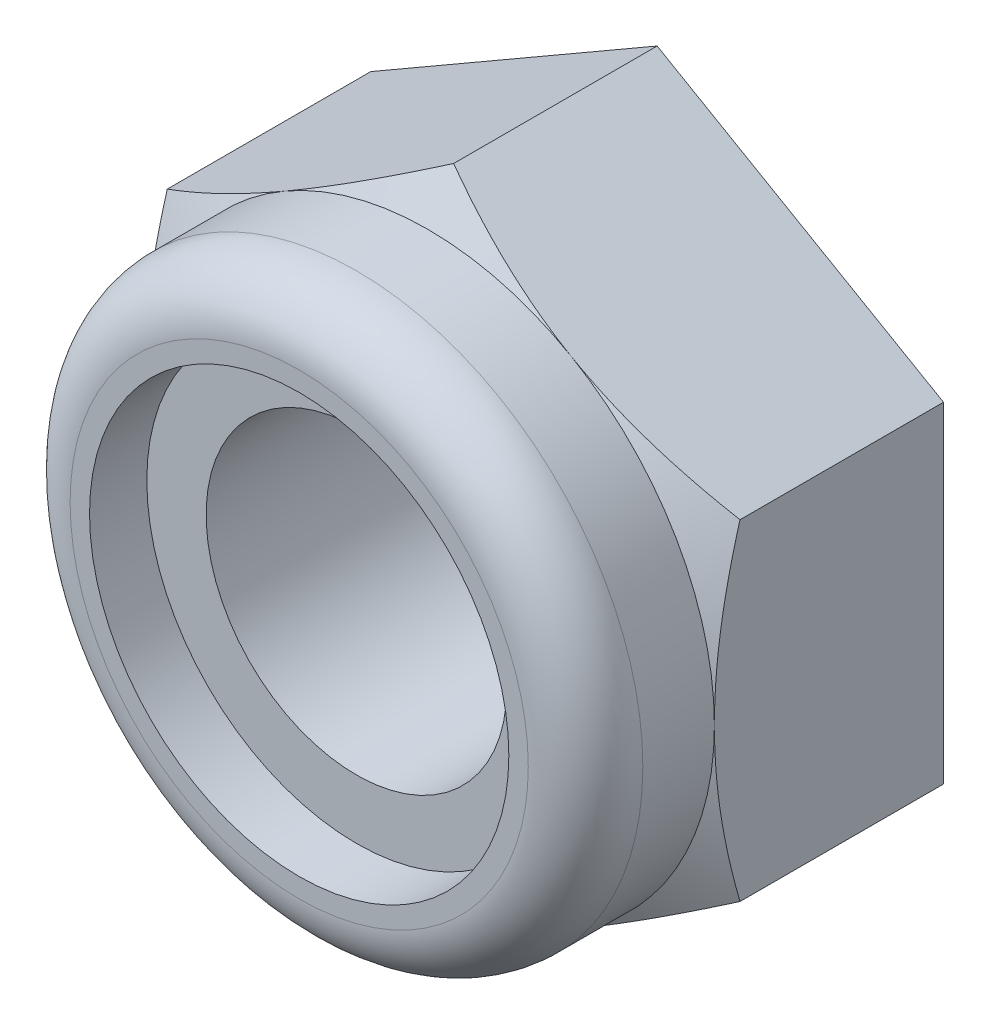
ISO-10303-21;
HEADER;
FILE_DESCRIPTION(('STEP AP214'),'2;1');
FILE_NAME('part.step','',(''),(''),'','','');
FILE_SCHEMA(('AUTOMOTIVE_DESIGN { 1 0 10303 214 1 1 1 1 }'));
ENDSEC;
DATA;
#1=APPLICATION_CONTEXT('core data for automotive mechanical design processes');
#2=APPLICATION_PROTOCOL_DEFINITION('international standard','automotive_design',2000,#1);
#3=PRODUCT_CONTEXT('',#1,'mechanical');
#4=PRODUCT('Part','Part','',(#3));
#5=PRODUCT_RELATED_PRODUCT_CATEGORY('part','',(#4));
#6=PRODUCT_DEFINITION_FORMATION('','',#4);
#7=PRODUCT_DEFINITION_CONTEXT('part definition',#1,'design');
#8=PRODUCT_DEFINITION('design','',#6,#7);
#9=PRODUCT_DEFINITION_SHAPE('','',#8);
#10=(LENGTH_UNIT() NAMED_UNIT(*) SI_UNIT(.MILLI.,.METRE.));
#11=(NAMED_UNIT(*) PLANE_ANGLE_UNIT() SI_UNIT($,.RADIAN.));
#12=(NAMED_UNIT(*) SI_UNIT($,.STERADIAN.) SOLID_ANGLE_UNIT());
#13=UNCERTAINTY_MEASURE_WITH_UNIT(LENGTH_MEASURE(1.E-05),#10,'distance_accuracy_value','');
#14=(GEOMETRIC_REPRESENTATION_CONTEXT(3) GLOBAL_UNCERTAINTY_ASSIGNED_CONTEXT((#13)) GLOBAL_UNIT_ASSIGNED_CONTEXT((#10,
#11,#12)) REPRESENTATION_CONTEXT('',''));
#15=CARTESIAN_POINT('',(0.,0.,0.));
#16=DIRECTION('',(0.,0.,1.));
#17=DIRECTION('',(1.,0.,0.));
#18=AXIS2_PLACEMENT_3D('',#15,#16,#17);
#19=CARTESIAN_POINT('',(0.,0.,-4.4));
#20=DIRECTION('',(0.,0.,1.));
#21=DIRECTION('',(1.,0.,0.));
#22=AXIS2_PLACEMENT_3D('',#19,#20,#21);
#23=CYLINDRICAL_SURFACE('',#22,2.1);
#24=CARTESIAN_POINT('',(0.,0.,1.6));
#25=DIRECTION('',(0.,0.,1.));
#26=DIRECTION('',(1.,0.,0.));
#27=AXIS2_PLACEMENT_3D('',#24,#25,#26);
#28=CIRCLE('',#27,2.1);
#29=CARTESIAN_POINT('',(2.1,0.,1.6));
#30=VERTEX_POINT('',#29);
#31=EDGE_CURVE('E367',#30,#30,#28,.T.);
#32=ORIENTED_EDGE('',*,*,#31,.T.);
#33=EDGE_LOOP('',(#32));
#34=FACE_BOUND('',#33,.T.);
#35=CARTESIAN_POINT('',(0.,0.,-1.8971227249455));
#36=DIRECTION('',(0.,0.,-1.));
#37=DIRECTION('',(-1.,0.,0.));
#38=AXIS2_PLACEMENT_3D('',#35,#36,#37);
#39=CIRCLE('',#38,2.1);
#40=CARTESIAN_POINT('',(-2.1,0.,-1.8971227249455));
#41=VERTEX_POINT('',#40);
#42=EDGE_CURVE('E127',#41,#41,#39,.F.);
#43=ORIENTED_EDGE('',*,*,#42,.F.);
#44=EDGE_LOOP('',(#43));
#45=FACE_BOUND('',#44,.T.);
#46=ADVANCED_FACE('F54',(#34,#45),#23,.F.);
#47=CARTESIAN_POINT('',(0.,4.61880215351701,-4.4));
#48=DIRECTION('',(-0.5,0.866025403784438,0.));
#49=DIRECTION('',(-0.866025403784438,-0.5,0.));
#50=AXIS2_PLACEMENT_3D('',#47,#48,#49);
#51=PLANE('',#50);
#52=DIRECTION('',(-0.866025403784438,-0.5,0.));
#53=VECTOR('',#52,1.);
#54=CARTESIAN_POINT('',(0.,4.61880215351701,-2.6));
#55=LINE('',#54,#53);
#56=CARTESIAN_POINT('',(0.,4.61880215351701,-2.6));
#57=VERTEX_POINT('',#56);
#58=CARTESIAN_POINT('',(-4.,2.3094010767585,-2.6));
#59=VERTEX_POINT('',#58);
#60=EDGE_CURVE('E413',#57,#59,#55,.T.);
#61=ORIENTED_EDGE('',*,*,#60,.T.);
#62=DIRECTION('',(0.,0.,1.));
#63=VECTOR('',#62,1.);
#64=CARTESIAN_POINT('',(-4.,2.3094010767585,-4.4));
#65=LINE('',#64,#63);
#66=CARTESIAN_POINT('',(-4.,2.3094010767585,0.242734410091837));
#67=VERTEX_POINT('',#66);
#68=EDGE_CURVE('E150',#59,#67,#65,.T.);
#69=ORIENTED_EDGE('',*,*,#68,.T.);
#70=CARTESIAN_POINT('',(-4.00000000000001,2.3094010767585,0.242734410091836));
#71=CARTESIAN_POINT('',(-3.82575509941556,2.41000141701585,0.300843254021568));
#72=CARTESIAN_POINT('',(-3.64998668642037,2.51148135757366,0.353730679374339));
#73=CARTESIAN_POINT('',(-3.29691182621124,2.71532922315949,0.445810427784581));
#74=CARTESIAN_POINT('',(-3.11962086224101,2.81768820893259,0.485082757176557));
#75=CARTESIAN_POINT('',(-2.85195331749383,2.9722261379457,0.531878924916784));
#76=CARTESIAN_POINT('',(-2.7623723562373,3.02394573004142,0.545464733371018));
#77=CARTESIAN_POINT('',(-2.58279348128188,3.1276256418377,0.568282401920135));
#78=CARTESIAN_POINT('',(-2.49279557589336,3.17958595674027,0.577514348420689));
#79=CARTESIAN_POINT('',(-2.31199667955197,3.28397024821216,0.591428046662609));
#80=CARTESIAN_POINT('',(-2.22119409510796,3.33639514478402,0.596082420263347));
#81=CARTESIAN_POINT('',(-2.03948107892015,3.44130720359531,0.600649416944741));
#82=CARTESIAN_POINT('',(-1.94857062855305,3.49379437658691,0.6005610454281));
#83=CARTESIAN_POINT('',(-1.8577066320852,3.54625472940727,0.598052513925055));
#84=B_SPLINE_CURVE_WITH_KNOTS('',3,(#70,#71,#72,#73,#74,#75,#76,#77,#78,#79,#80,#81,#82,#83),
.UNSPECIFIED.,.F.,.F.,(4,2,2,2,2,2,4),(0.,0.628587110626975,1.25341522710677,1.56631348907087,
1.87920554107184,2.19395779996624,2.50877606556367),.UNSPECIFIED.);
#85=CARTESIAN_POINT('',(-2.,3.46410161513776,0.599999999999999));
#86=VERTEX_POINT('',#85);
#87=EDGE_CURVE('E291',#67,#86,#84,.T.);
#88=ORIENTED_EDGE('',*,*,#87,.T.);
#89=CARTESIAN_POINT('',(0.,4.61880215351701,0.242734410091839));
#90=CARTESIAN_POINT('',(-0.174244900584449,4.51820181325966,0.30084325402157));
#91=CARTESIAN_POINT('',(-0.350013313579644,4.41672187270185,0.353730679374341));
#92=CARTESIAN_POINT('',(-0.703088173788774,4.21287400711602,0.445810427784582));
#93=CARTESIAN_POINT('',(-0.880379137758998,4.11051502134292,0.485082757176558));
#94=CARTESIAN_POINT('',(-1.14804668250618,3.95597709232981,0.531878924916784));
#95=CARTESIAN_POINT('',(-1.2376276437627,3.90425750023409,0.545464733371018));
#96=CARTESIAN_POINT('',(-1.41720651871812,3.80057758843781,0.568282401920135));
#97=CARTESIAN_POINT('',(-1.50720442410665,3.74861727353524,0.577514348420689));
#98=CARTESIAN_POINT('',(-1.68800332044804,3.64423298206335,0.591428046662609));
#99=CARTESIAN_POINT('',(-1.77880590489205,3.59180808549149,0.596082420263347));
#100=CARTESIAN_POINT('',(-1.96051892107985,3.4868960266802,0.60064941694474));
#101=CARTESIAN_POINT('',(-2.05142937144696,3.4344088536886,0.6005610454281));
#102=CARTESIAN_POINT('',(-2.1422933679148,3.38194850086825,0.598052513925055));
#103=B_SPLINE_CURVE_WITH_KNOTS('',3,(#89,#90,#91,#92,#93,#94,#95,#96,#97,#98,#99,#100,#101,
#102),.UNSPECIFIED.,.F.,.F.,(4,2,2,2,2,2,4),(0.,0.628587110626971,1.25341522710677,
1.56631348907086,1.87920554107183,2.19395779996622,2.50877606556365),.UNSPECIFIED.);
#104=CARTESIAN_POINT('',(0.,4.61880215351701,0.242734410091834));
#105=VERTEX_POINT('',#104);
#106=EDGE_CURVE('E141',#86,#105,#103,.F.);
#107=ORIENTED_EDGE('',*,*,#106,.T.);
#108=DIRECTION('',(0.,0.,1.));
#109=VECTOR('',#108,1.);
#110=CARTESIAN_POINT('',(0.,4.61880215351701,-4.4));
#111=LINE('',#110,#109);
#112=EDGE_CURVE('E148',#57,#105,#111,.T.);
#113=ORIENTED_EDGE('',*,*,#112,.F.);
#114=EDGE_LOOP('',(#61,#69,#88,#107,#113));
#115=FACE_BOUND('',#114,.T.);
#116=ADVANCED_FACE('F173',(#115),#51,.T.);
#117=CARTESIAN_POINT('',(4.,2.3094010767585,-4.4));
#118=DIRECTION('',(0.5,0.866025403784438,0.));
#119=DIRECTION('',(-0.866025403784438,0.5,0.));
#120=AXIS2_PLACEMENT_3D('',#117,#118,#119);
#121=PLANE('',#120);
#122=ORIENTED_EDGE('',*,*,#112,.T.);
#123=CARTESIAN_POINT('',(0.,4.61880215351701,0.242734410091837));
#124=CARTESIAN_POINT('',(0.174244900584437,4.51820181325966,0.300843254021569));
#125=CARTESIAN_POINT('',(0.350013313579632,4.41672187270185,0.35373067937434));
#126=CARTESIAN_POINT('',(0.703088173788763,4.21287400711602,0.445810427784583));
#127=CARTESIAN_POINT('',(0.880379137758989,4.11051502134292,0.485082757176559));
#128=CARTESIAN_POINT('',(1.14804668250617,3.95597709232981,0.531878924916785));
#129=CARTESIAN_POINT('',(1.2376276437627,3.90425750023409,0.545464733371019));
#130=CARTESIAN_POINT('',(1.41720651871811,3.80057758843781,0.568282401920137));
#131=CARTESIAN_POINT('',(1.50720442410664,3.74861727353524,0.577514348420691));
#132=CARTESIAN_POINT('',(1.68800332044803,3.64423298206335,0.591428046662611));
#133=CARTESIAN_POINT('',(1.77880590489204,3.59180808549149,0.59608242026335));
#134=CARTESIAN_POINT('',(1.96051892107985,3.4868960266802,0.600649416944743));
#135=CARTESIAN_POINT('',(2.05142937144695,3.4344088536886,0.600561045428103));
#136=CARTESIAN_POINT('',(2.1422933679148,3.38194850086825,0.598052513925058));
#137=B_SPLINE_CURVE_WITH_KNOTS('',3,(#123,#124,#125,#126,#127,#128,#129,#130,#131,#132,#133,
#134,#135,#136),.UNSPECIFIED.,.F.,.F.,(4,2,2,2,2,2,4),(0.,0.628587110626975,1.25341522710677,
1.56631348907087,1.87920554107184,2.19395779996623,2.50877606556367),.UNSPECIFIED.);
#138=CARTESIAN_POINT('',(2.,3.46410161513775,0.600000000000001));
#139=VERTEX_POINT('',#138);
#140=EDGE_CURVE('E136',#105,#139,#137,.T.);
#141=ORIENTED_EDGE('',*,*,#140,.T.);
#142=CARTESIAN_POINT('',(4.,2.3094010767585,0.242734410091839));
#143=CARTESIAN_POINT('',(3.82575509941556,2.41000141701585,0.30084325402157));
#144=CARTESIAN_POINT('',(3.64998668642036,2.51148135757366,0.353730679374342));
#145=CARTESIAN_POINT('',(3.29691182621123,2.71532922315949,0.445810427784584));
#146=CARTESIAN_POINT('',(3.11962086224101,2.81768820893259,0.485082757176559));
#147=CARTESIAN_POINT('',(2.85195331749383,2.9722261379457,0.531878924916786));
#148=CARTESIAN_POINT('',(2.7623723562373,3.02394573004142,0.54546473337102));
#149=CARTESIAN_POINT('',(2.58279348128188,3.1276256418377,0.568282401920137));
#150=CARTESIAN_POINT('',(2.49279557589336,3.17958595674027,0.577514348420692));
#151=CARTESIAN_POINT('',(2.31199667955197,3.28397024821215,0.591428046662611));
#152=CARTESIAN_POINT('',(2.22119409510795,3.33639514478402,0.59608242026335));
#153=CARTESIAN_POINT('',(2.03948107892015,3.44130720359531,0.600649416944743));
#154=CARTESIAN_POINT('',(1.94857062855305,3.49379437658691,0.600561045428102));
#155=CARTESIAN_POINT('',(1.8577066320852,3.54625472940726,0.598052513925058));
#156=B_SPLINE_CURVE_WITH_KNOTS('',3,(#142,#143,#144,#145,#146,#147,#148,#149,#150,#151,#152,
#153,#154,#155),.UNSPECIFIED.,.F.,.F.,(4,2,2,2,2,2,4),(0.,0.628587110626974,1.25341522710677,
1.56631348907087,1.87920554107184,2.19395779996623,2.50877606556366),.UNSPECIFIED.);
#157=CARTESIAN_POINT('',(4.,2.3094010767585,0.242734410091837));
#158=VERTEX_POINT('',#157);
#159=EDGE_CURVE('E129',#139,#158,#156,.F.);
#160=ORIENTED_EDGE('',*,*,#159,.T.);
#161=DIRECTION('',(0.,0.,1.));
#162=VECTOR('',#161,1.);
#163=CARTESIAN_POINT('',(4.,2.3094010767585,-4.4));
#164=LINE('',#163,#162);
#165=CARTESIAN_POINT('',(4.,2.3094010767585,-2.6));
#166=VERTEX_POINT('',#165);
#167=EDGE_CURVE('E310',#166,#158,#164,.T.);
#168=ORIENTED_EDGE('',*,*,#167,.F.);
#169=DIRECTION('',(-0.866025403784438,0.5,0.));
#170=VECTOR('',#169,1.);
#171=CARTESIAN_POINT('',(4.,2.3094010767585,-2.6));
#172=LINE('',#171,#170);
#173=EDGE_CURVE('E415',#166,#57,#172,.T.);
#174=ORIENTED_EDGE('',*,*,#173,.T.);
#175=EDGE_LOOP('',(#122,#141,#160,#168,#174));
#176=FACE_BOUND('',#175,.T.);
#177=ADVANCED_FACE('F145',(#176),#121,.T.);
#178=CARTESIAN_POINT('',(4.,2.3094010767585,-4.4));
#179=DIRECTION('',(-1.,0.,0.));
#180=DIRECTION('',(0.,0.,1.));
#181=AXIS2_PLACEMENT_3D('',#178,#179,#180);
#182=PLANE('',#181);
#183=DIRECTION('',(0.,0.,1.));
#184=VECTOR('',#183,1.);
#185=CARTESIAN_POINT('',(4.,-2.30940107675851,-4.4));
#186=LINE('',#185,#184);
#187=CARTESIAN_POINT('',(4.,-2.30940107675851,-2.6));
#188=VERTEX_POINT('',#187);
#189=CARTESIAN_POINT('',(4.,-2.30940107675851,0.242734410091836));
#190=VERTEX_POINT('',#189);
#191=EDGE_CURVE('E305',#188,#190,#186,.T.);
#192=ORIENTED_EDGE('',*,*,#191,.F.);
#193=DIRECTION('',(0.,1.,0.));
#194=VECTOR('',#193,1.);
#195=CARTESIAN_POINT('',(4.,4.61880215351701,-2.6));
#196=LINE('',#195,#194);
#197=EDGE_CURVE('E14',#188,#166,#196,.T.);
#198=ORIENTED_EDGE('',*,*,#197,.T.);
#199=ORIENTED_EDGE('',*,*,#167,.T.);
#200=CARTESIAN_POINT('',(4.,2.3094010767585,0.24273441009184));
#201=CARTESIAN_POINT('',(4.,2.1082003962438,0.300843254021571));
#202=CARTESIAN_POINT('',(4.,1.90524051512819,0.353730679374342));
#203=CARTESIAN_POINT('',(4.,1.49754478395652,0.445810427784584));
#204=CARTESIAN_POINT('',(4.,1.29282681241033,0.485082757176559));
#205=CARTESIAN_POINT('',(4.,0.983750954384108,0.531878924916786));
#206=CARTESIAN_POINT('',(4.,0.880311770192666,0.54546473337102));
#207=CARTESIAN_POINT('',(4.,0.672951946600103,0.568282401920137));
#208=CARTESIAN_POINT('',(4.,0.56903131679497,0.577514348420691));
#209=CARTESIAN_POINT('',(4.,0.360262733851193,0.59142804666261));
#210=CARTESIAN_POINT('',(4.,0.255412940707462,0.596082420263349));
#211=CARTESIAN_POINT('',(4.,0.045588823084889,0.600649416944742));
#212=CARTESIAN_POINT('',(4.,-0.059385522898308,0.600561045428102));
#213=CARTESIAN_POINT('',(4.,-0.164306228539019,0.598052513925057));
#214=B_SPLINE_CURVE_WITH_KNOTS('',3,(#200,#201,#202,#203,#204,#205,#206,#207,#208,#209,#210,
#211,#212,#213),.UNSPECIFIED.,.F.,.F.,(4,2,2,2,2,2,4),(0.,0.628587110626973,1.25341522710677,
1.56631348907087,1.87920554107183,2.19395779996623,2.50877606556366),.UNSPECIFIED.);
#215=CARTESIAN_POINT('',(4.,0.,0.6));
#216=VERTEX_POINT('',#215);
#217=EDGE_CURVE('E131',#216,#158,#214,.F.);
#218=ORIENTED_EDGE('',*,*,#217,.F.);
#219=CARTESIAN_POINT('',(4.,-2.3094010767585,0.24273441009184));
#220=CARTESIAN_POINT('',(4.,-2.1082003962438,0.300843254021572));
#221=CARTESIAN_POINT('',(4.,-1.90524051512819,0.353730679374343));
#222=CARTESIAN_POINT('',(4.,-1.49754478395652,0.445810427784584));
#223=CARTESIAN_POINT('',(4.,-1.29282681241033,0.485082757176559));
#224=CARTESIAN_POINT('',(4.,-0.98375095438411,0.531878924916785));
#225=CARTESIAN_POINT('',(4.,-0.880311770192668,0.54546473337102));
#226=CARTESIAN_POINT('',(4.,-0.672951946600106,0.568282401920137));
#227=CARTESIAN_POINT('',(4.,-0.569031316794973,0.577514348420691));
#228=CARTESIAN_POINT('',(4.,-0.360262733851196,0.59142804666261));
#229=CARTESIAN_POINT('',(4.,-0.255412940707466,0.596082420263349));
#230=CARTESIAN_POINT('',(4.,-0.0455888230848929,0.600649416944742));
#231=CARTESIAN_POINT('',(4.,0.0593855228983036,0.600561045428102));
#232=CARTESIAN_POINT('',(4.,0.164306228539015,0.598052513925057));
#233=B_SPLINE_CURVE_WITH_KNOTS('',3,(#219,#220,#221,#222,#223,#224,#225,#226,#227,#228,#229,
#230,#231,#232),.UNSPECIFIED.,.F.,.F.,(4,2,2,2,2,2,4),(0.,0.628587110626971,1.25341522710677,
1.56631348907086,1.87920554107183,2.19395779996622,2.50877606556365),.UNSPECIFIED.);
#234=EDGE_CURVE('E233',#190,#216,#233,.T.);
#235=ORIENTED_EDGE('',*,*,#234,.F.);
#236=EDGE_LOOP('',(#192,#198,#199,#218,#235));
#237=FACE_BOUND('',#236,.T.);
#238=ADVANCED_FACE('F172',(#237),#182,.F.);
#239=CARTESIAN_POINT('',(0.,-4.61880215351702,-4.4));
#240=DIRECTION('',(0.5,-0.866025403784438,0.));
#241=DIRECTION('',(0.866025403784438,0.5,0.));
#242=AXIS2_PLACEMENT_3D('',#239,#240,#241);
#243=PLANE('',#242);
#244=ORIENTED_EDGE('',*,*,#191,.T.);
#245=CARTESIAN_POINT('',(4.,-2.30940107675851,0.242734410091835));
#246=CARTESIAN_POINT('',(3.82575509941556,-2.41000141701586,0.300843254021566));
#247=CARTESIAN_POINT('',(3.64998668642036,-2.51148135757367,0.353730679374337));
#248=CARTESIAN_POINT('',(3.29691182621123,-2.7153292231595,0.445810427784579));
#249=CARTESIAN_POINT('',(3.11962086224101,-2.8176882089326,0.485082757176554));
#250=CARTESIAN_POINT('',(2.85195331749383,-2.97222613794571,0.53187892491678));
#251=CARTESIAN_POINT('',(2.7623723562373,-3.02394573004143,0.545464733371014));
#252=CARTESIAN_POINT('',(2.58279348128188,-3.12762564183772,0.56828240192013));
#253=CARTESIAN_POINT('',(2.49279557589336,-3.17958595674028,0.577514348420685));
#254=CARTESIAN_POINT('',(2.31199667955197,-3.28397024821217,0.591428046662604));
#255=CARTESIAN_POINT('',(2.22119409510795,-3.33639514478404,0.596082420263342));
#256=CARTESIAN_POINT('',(2.03948107892015,-3.44130720359532,0.600649416944735));
#257=CARTESIAN_POINT('',(1.94857062855304,-3.49379437658692,0.600561045428094));
#258=CARTESIAN_POINT('',(1.8577066320852,-3.54625472940728,0.59805251392505));
#259=B_SPLINE_CURVE_WITH_KNOTS('',3,(#245,#246,#247,#248,#249,#250,#251,#252,#253,#254,#255,
#256,#257,#258),.UNSPECIFIED.,.F.,.F.,(4,2,2,2,2,2,4),(0.,0.628587110626974,1.25341522710677,
1.56631348907087,1.87920554107184,2.19395779996623,2.50877606556366),.UNSPECIFIED.);
#260=CARTESIAN_POINT('',(2.,-3.46410161513776,0.599999999999997));
#261=VERTEX_POINT('',#260);
#262=EDGE_CURVE('E226',#190,#261,#259,.T.);
#263=ORIENTED_EDGE('',*,*,#262,.T.);
#264=CARTESIAN_POINT('',(0.,-4.61880215351702,0.242734410091832));
#265=CARTESIAN_POINT('',(0.174244900584447,-4.51820181325967,0.300843254021563));
#266=CARTESIAN_POINT('',(0.350013313579643,-4.41672187270186,0.353730679374334));
#267=CARTESIAN_POINT('',(0.703088173788774,-4.21287400711603,0.445810427784576));
#268=CARTESIAN_POINT('',(0.880379137758999,-4.11051502134293,0.485082757176552));
#269=CARTESIAN_POINT('',(1.14804668250618,-3.95597709232982,0.531878924916779));
#270=CARTESIAN_POINT('',(1.23762764376271,-3.9042575002341,0.545464733371012));
#271=CARTESIAN_POINT('',(1.41720651871812,-3.80057758843782,0.56828240192013));
#272=CARTESIAN_POINT('',(1.50720442410665,-3.74861727353525,0.577514348420684));
#273=CARTESIAN_POINT('',(1.68800332044804,-3.64423298206336,0.591428046662604));
#274=CARTESIAN_POINT('',(1.77880590489205,-3.5918080854915,0.596082420263342));
#275=CARTESIAN_POINT('',(1.96051892107986,-3.48689602668021,0.600649416944735));
#276=CARTESIAN_POINT('',(2.05142937144696,-3.43440885368861,0.600561045428094));
#277=CARTESIAN_POINT('',(2.14229336791481,-3.38194850086826,0.59805251392505));
#278=B_SPLINE_CURVE_WITH_KNOTS('',3,(#264,#265,#266,#267,#268,#269,#270,#271,#272,#273,#274,
#275,#276,#277),.UNSPECIFIED.,.F.,.F.,(4,2,2,2,2,2,4),(0.,0.628587110626974,1.25341522710677,
1.56631348907087,1.87920554107184,2.19395779996623,2.50877606556366),.UNSPECIFIED.);
#279=CARTESIAN_POINT('',(0.,-4.61880215351702,0.242734410091828));
#280=VERTEX_POINT('',#279);
#281=EDGE_CURVE('E234',#261,#280,#278,.F.);
#282=ORIENTED_EDGE('',*,*,#281,.T.);
#283=DIRECTION('',(0.,0.,1.));
#284=VECTOR('',#283,1.);
#285=CARTESIAN_POINT('',(0.,-4.61880215351702,-4.4));
#286=LINE('',#285,#284);
#287=CARTESIAN_POINT('',(0.,-4.61880215351702,-2.6));
#288=VERTEX_POINT('',#287);
#289=EDGE_CURVE('E311',#288,#280,#286,.T.);
#290=ORIENTED_EDGE('',*,*,#289,.F.);
#291=DIRECTION('',(0.866025403784438,0.5,0.));
#292=VECTOR('',#291,1.);
#293=CARTESIAN_POINT('',(0.,-4.61880215351702,-2.6));
#294=LINE('',#293,#292);
#295=EDGE_CURVE('E309',#288,#188,#294,.T.);
#296=ORIENTED_EDGE('',*,*,#295,.T.);
#297=EDGE_LOOP('',(#244,#263,#282,#290,#296));
#298=FACE_BOUND('',#297,.T.);
#299=ADVANCED_FACE('F215',(#298),#243,.T.);
#300=CARTESIAN_POINT('',(-4.,-2.30940107675851,-4.4));
#301=DIRECTION('',(-0.5,-0.866025403784438,0.));
#302=DIRECTION('',(0.866025403784438,-0.5,0.));
#303=AXIS2_PLACEMENT_3D('',#300,#301,#302);
#304=PLANE('',#303);
#305=ORIENTED_EDGE('',*,*,#289,.T.);
#306=CARTESIAN_POINT('',(0.,-4.61880215351702,0.242734410091833));
#307=CARTESIAN_POINT('',(-0.17424490058444,-4.51820181325967,0.300843254021564));
#308=CARTESIAN_POINT('',(-0.350013313579635,-4.41672187270186,0.353730679374335));
#309=CARTESIAN_POINT('',(-0.703088173788766,-4.21287400711603,0.445810427784578));
#310=CARTESIAN_POINT('',(-0.880379137758992,-4.11051502134293,0.485082757176553));
#311=CARTESIAN_POINT('',(-1.14804668250617,-3.95597709232982,0.531878924916781));
#312=CARTESIAN_POINT('',(-1.2376276437627,-3.9042575002341,0.545464733371015));
#313=CARTESIAN_POINT('',(-1.41720651871812,-3.80057758843782,0.568282401920132));
#314=CARTESIAN_POINT('',(-1.50720442410664,-3.74861727353525,0.577514348420686));
#315=CARTESIAN_POINT('',(-1.68800332044803,-3.64423298206336,0.591428046662606));
#316=CARTESIAN_POINT('',(-1.77880590489205,-3.5918080854915,0.596082420263344));
#317=CARTESIAN_POINT('',(-1.96051892107985,-3.48689602668021,0.600649416944738));
#318=CARTESIAN_POINT('',(-2.05142937144696,-3.43440885368861,0.600561045428097));
#319=CARTESIAN_POINT('',(-2.1422933679148,-3.38194850086825,0.598052513925053));
#320=B_SPLINE_CURVE_WITH_KNOTS('',3,(#306,#307,#308,#309,#310,#311,#312,#313,#314,#315,#316,
#317,#318,#319),.UNSPECIFIED.,.F.,.F.,(4,2,2,2,2,2,4),(0.,0.628587110626975,1.25341522710677,
1.56631348907087,1.87920554107184,2.19395779996624,2.50877606556367),.UNSPECIFIED.);
#321=CARTESIAN_POINT('',(-2.,-3.46410161513776,0.599999999999998));
#322=VERTEX_POINT('',#321);
#323=EDGE_CURVE('E245',#280,#322,#320,.T.);
#324=ORIENTED_EDGE('',*,*,#323,.T.);
#325=CARTESIAN_POINT('',(-4.,-2.30940107675851,0.242734410091837));
#326=CARTESIAN_POINT('',(-3.82575509941556,-2.41000141701586,0.300843254021568));
#327=CARTESIAN_POINT('',(-3.64998668642036,-2.51148135757367,0.353730679374339));
#328=CARTESIAN_POINT('',(-3.29691182621123,-2.7153292231595,0.445810427784581));
#329=CARTESIAN_POINT('',(-3.11962086224101,-2.8176882089326,0.485082757176556));
#330=CARTESIAN_POINT('',(-2.85195331749383,-2.97222613794571,0.531878924916782));
#331=CARTESIAN_POINT('',(-2.7623723562373,-3.02394573004143,0.545464733371016));
#332=CARTESIAN_POINT('',(-2.58279348128188,-3.12762564183771,0.568282401920133));
#333=CARTESIAN_POINT('',(-2.49279557589336,-3.17958595674028,0.577514348420687));
#334=CARTESIAN_POINT('',(-2.31199667955197,-3.28397024821217,0.591428046662606));
#335=CARTESIAN_POINT('',(-2.22119409510795,-3.33639514478403,0.596082420263345));
#336=CARTESIAN_POINT('',(-2.03948107892015,-3.44130720359532,0.600649416944738));
#337=CARTESIAN_POINT('',(-1.94857062855304,-3.49379437658692,0.600561045428097));
#338=CARTESIAN_POINT('',(-1.8577066320852,-3.54625472940727,0.598052513925052));
#339=B_SPLINE_CURVE_WITH_KNOTS('',3,(#325,#326,#327,#328,#329,#330,#331,#332,#333,#334,#335,
#336,#337,#338),.UNSPECIFIED.,.F.,.F.,(4,2,2,2,2,2,4),(0.,0.628587110626974,1.25341522710677,
1.56631348907087,1.87920554107184,2.19395779996623,2.50877606556366),.UNSPECIFIED.);
#340=CARTESIAN_POINT('',(-4.,-2.30940107675851,0.242734410091834));
#341=VERTEX_POINT('',#340);
#342=EDGE_CURVE('E252',#322,#341,#339,.F.);
#343=ORIENTED_EDGE('',*,*,#342,.T.);
#344=DIRECTION('',(0.,0.,1.));
#345=VECTOR('',#344,1.);
#346=CARTESIAN_POINT('',(-4.,-2.30940107675851,-4.4));
#347=LINE('',#346,#345);
#348=CARTESIAN_POINT('',(-4.,-2.30940107675851,-2.6));
#349=VERTEX_POINT('',#348);
#350=EDGE_CURVE('E315',#349,#341,#347,.T.);
#351=ORIENTED_EDGE('',*,*,#350,.F.);
#352=DIRECTION('',(0.866025403784438,-0.5,0.));
#353=VECTOR('',#352,1.);
#354=CARTESIAN_POINT('',(-4.,-2.30940107675851,-2.6));
#355=LINE('',#354,#353);
#356=EDGE_CURVE('E334',#349,#288,#355,.T.);
#357=ORIENTED_EDGE('',*,*,#356,.T.);
#358=EDGE_LOOP('',(#305,#324,#343,#351,#357));
#359=FACE_BOUND('',#358,.T.);
#360=ADVANCED_FACE('F218',(#359),#304,.T.);
#361=CARTESIAN_POINT('',(-4.,2.3094010767585,-4.4));
#362=DIRECTION('',(-1.,0.,0.));
#363=DIRECTION('',(0.,0.,1.));
#364=AXIS2_PLACEMENT_3D('',#361,#362,#363);
#365=PLANE('',#364);
#366=ORIENTED_EDGE('',*,*,#68,.F.);
#367=DIRECTION('',(0.,-1.,0.));
#368=VECTOR('',#367,1.);
#369=CARTESIAN_POINT('',(-4.,2.3094010767585,-2.6));
#370=LINE('',#369,#368);
#371=EDGE_CURVE('E65',#59,#349,#370,.T.);
#372=ORIENTED_EDGE('',*,*,#371,.T.);
#373=ORIENTED_EDGE('',*,*,#350,.T.);
#374=CARTESIAN_POINT('',(-4.,-2.3094010767585,0.242734410091839));
#375=CARTESIAN_POINT('',(-4.,-2.10820039624381,0.30084325402157));
#376=CARTESIAN_POINT('',(-4.,-1.90524051512819,0.353730679374341));
#377=CARTESIAN_POINT('',(-4.,-1.49754478395653,0.445810427784583));
#378=CARTESIAN_POINT('',(-4.,-1.29282681241033,0.485082757176558));
#379=CARTESIAN_POINT('',(-4.,-0.983750954384113,0.531878924916785));
#380=CARTESIAN_POINT('',(-4.,-0.880311770192671,0.545464733371019));
#381=CARTESIAN_POINT('',(-4.,-0.672951946600109,0.568282401920136));
#382=CARTESIAN_POINT('',(-4.,-0.569031316794976,0.57751434842069));
#383=CARTESIAN_POINT('',(-4.,-0.3602627338512,0.59142804666261));
#384=CARTESIAN_POINT('',(-4.,-0.25541294070747,0.596082420263348));
#385=CARTESIAN_POINT('',(-4.,-0.0455888230848968,0.600649416944742));
#386=CARTESIAN_POINT('',(-4.,0.0593855228983,0.600561045428101));
#387=CARTESIAN_POINT('',(-4.,0.164306228539012,0.598052513925057));
#388=B_SPLINE_CURVE_WITH_KNOTS('',3,(#374,#375,#376,#377,#378,#379,#380,#381,#382,#383,#384,
#385,#386,#387),.UNSPECIFIED.,.F.,.F.,(4,2,2,2,2,2,4),(0.,0.628587110626972,1.25341522710677,
1.56631348907086,1.87920554107183,2.19395779996622,2.50877606556365),.UNSPECIFIED.);
#389=CARTESIAN_POINT('',(-4.,0.,0.6));
#390=VERTEX_POINT('',#389);
#391=EDGE_CURVE('E259',#341,#390,#388,.T.);
#392=ORIENTED_EDGE('',*,*,#391,.T.);
#393=CARTESIAN_POINT('',(-4.,2.3094010767585,0.242734410091839));
#394=CARTESIAN_POINT('',(-4.,2.10820039624381,0.300843254021571));
#395=CARTESIAN_POINT('',(-4.,1.90524051512819,0.353730679374342));
#396=CARTESIAN_POINT('',(-4.,1.49754478395653,0.445810427784584));
#397=CARTESIAN_POINT('',(-4.,1.29282681241033,0.485082757176559));
#398=CARTESIAN_POINT('',(-4.,0.983750954384109,0.531878924916785));
#399=CARTESIAN_POINT('',(-4.,0.880311770192667,0.54546473337102));
#400=CARTESIAN_POINT('',(-4.,0.672951946600104,0.568282401920137));
#401=CARTESIAN_POINT('',(-4.,0.569031316794971,0.577514348420691));
#402=CARTESIAN_POINT('',(-4.,0.360262733851194,0.59142804666261));
#403=CARTESIAN_POINT('',(-4.,0.255412940707463,0.596082420263349));
#404=CARTESIAN_POINT('',(-4.,0.0455888230848896,0.600649416944742));
#405=CARTESIAN_POINT('',(-4.,-0.0593855228983075,0.600561045428102));
#406=CARTESIAN_POINT('',(-4.,-0.164306228539019,0.598052513925057));
#407=B_SPLINE_CURVE_WITH_KNOTS('',3,(#393,#394,#395,#396,#397,#398,#399,#400,#401,#402,#403,
#404,#405,#406),.UNSPECIFIED.,.F.,.F.,(4,2,2,2,2,2,4),(0.,0.628587110626973,1.25341522710677,
1.56631348907087,1.87920554107184,2.19395779996623,2.50877606556366),.UNSPECIFIED.);
#408=EDGE_CURVE('E126',#390,#67,#407,.F.);
#409=ORIENTED_EDGE('',*,*,#408,.T.);
#410=EDGE_LOOP('',(#366,#372,#373,#392,#409));
#411=FACE_BOUND('',#410,.T.);
#412=ADVANCED_FACE('F267',(#411),#365,.T.);
#413=CARTESIAN_POINT('',(0.,4.61880215351701,-2.6));
#414=DIRECTION('',(0.,0.,-1.));
#415=DIRECTION('',(-1.,0.,0.));
#416=AXIS2_PLACEMENT_3D('',#413,#414,#415);
#417=PLANE('',#416);
#418=ORIENTED_EDGE('',*,*,#197,.F.);
#419=ORIENTED_EDGE('',*,*,#295,.F.);
#420=ORIENTED_EDGE('',*,*,#356,.F.);
#421=ORIENTED_EDGE('',*,*,#371,.F.);
#422=ORIENTED_EDGE('',*,*,#60,.F.);
#423=ORIENTED_EDGE('',*,*,#173,.F.);
#424=EDGE_LOOP('',(#418,#419,#420,#421,#422,#423));
#425=FACE_BOUND('',#424,.T.);
#426=CARTESIAN_POINT('',(0.,0.,-2.6));
#427=DIRECTION('',(0.,0.,-1.));
#428=DIRECTION('',(-1.,0.,0.));
#429=AXIS2_PLACEMENT_3D('',#426,#427,#428);
#430=CIRCLE('',#429,3.10381277935342);
#431=CARTESIAN_POINT('',(-3.10381277935342,0.,-2.6));
#432=VERTEX_POINT('',#431);
#433=EDGE_CURVE('E289',#432,#432,#430,.F.);
#434=ORIENTED_EDGE('',*,*,#433,.T.);
#435=EDGE_LOOP('',(#434));
#436=FACE_BOUND('',#435,.T.);
#437=ADVANCED_FACE('F270',(#425,#436),#417,.T.);
#438=CARTESIAN_POINT('',(0.,0.,0.6));
#439=DIRECTION('',(0.,0.,-1.));
#440=DIRECTION('',(-1.,0.,0.));
#441=AXIS2_PLACEMENT_3D('',#438,#439,#440);
#442=CONICAL_SURFACE('',#441,4.,1.0471975511966);
#443=CARTESIAN_POINT('',(0.,0.,0.6));
#444=DIRECTION('',(0.,0.,-1.));
#445=DIRECTION('',(-1.,0.,0.));
#446=AXIS2_PLACEMENT_3D('',#443,#444,#445);
#447=CIRCLE('',#446,4.);
#448=EDGE_CURVE('E338',#322,#390,#447,.T.);
#449=ORIENTED_EDGE('',*,*,#448,.T.);
#450=ORIENTED_EDGE('',*,*,#391,.F.);
#451=ORIENTED_EDGE('',*,*,#342,.F.);
#452=EDGE_LOOP('',(#449,#450,#451));
#453=FACE_BOUND('',#452,.T.);
#454=ADVANCED_FACE('F429',(#453),#442,.T.);
#455=CARTESIAN_POINT('',(0.,0.,0.6));
#456=DIRECTION('',(0.,0.,-1.));
#457=DIRECTION('',(-1.,0.,0.));
#458=AXIS2_PLACEMENT_3D('',#455,#456,#457);
#459=CIRCLE('',#458,4.);
#460=EDGE_CURVE('E447',#261,#322,#459,.T.);
#461=ORIENTED_EDGE('',*,*,#460,.T.);
#462=ORIENTED_EDGE('',*,*,#323,.F.);
#463=ORIENTED_EDGE('',*,*,#281,.F.);
#464=EDGE_LOOP('',(#461,#462,#463));
#465=FACE_BOUND('',#464,.T.);
#466=ADVANCED_FACE('F433',(#465),#442,.T.);
#467=ORIENTED_EDGE('',*,*,#234,.T.);
#468=CARTESIAN_POINT('',(0.,0.,0.6));
#469=DIRECTION('',(0.,0.,-1.));
#470=DIRECTION('',(-1.,0.,0.));
#471=AXIS2_PLACEMENT_3D('',#468,#469,#470);
#472=CIRCLE('',#471,4.);
#473=EDGE_CURVE('E122',#216,#261,#472,.T.);
#474=ORIENTED_EDGE('',*,*,#473,.T.);
#475=ORIENTED_EDGE('',*,*,#262,.F.);
#476=EDGE_LOOP('',(#467,#474,#475));
#477=FACE_BOUND('',#476,.T.);
#478=ADVANCED_FACE('F301',(#477),#442,.T.);
#479=CARTESIAN_POINT('',(0.,0.,0.6));
#480=DIRECTION('',(0.,0.,1.));
#481=DIRECTION('',(1.,0.,0.));
#482=AXIS2_PLACEMENT_3D('',#479,#480,#481);
#483=CIRCLE('',#482,4.);
#484=EDGE_CURVE('E115',#216,#139,#483,.T.);
#485=ORIENTED_EDGE('',*,*,#484,.F.);
#486=ORIENTED_EDGE('',*,*,#217,.T.);
#487=ORIENTED_EDGE('',*,*,#159,.F.);
#488=EDGE_LOOP('',(#485,#486,#487));
#489=FACE_BOUND('',#488,.T.);
#490=ADVANCED_FACE('F130',(#489),#442,.T.);
#491=CARTESIAN_POINT('',(0.,0.,0.6));
#492=DIRECTION('',(0.,0.,-1.));
#493=DIRECTION('',(-1.,0.,0.));
#494=AXIS2_PLACEMENT_3D('',#491,#492,#493);
#495=CIRCLE('',#494,4.);
#496=EDGE_CURVE('E59',#86,#139,#495,.T.);
#497=ORIENTED_EDGE('',*,*,#496,.T.);
#498=ORIENTED_EDGE('',*,*,#140,.F.);
#499=ORIENTED_EDGE('',*,*,#106,.F.);
#500=EDGE_LOOP('',(#497,#498,#499));
#501=FACE_BOUND('',#500,.T.);
#502=ADVANCED_FACE('F139',(#501),#442,.T.);
#503=ORIENTED_EDGE('',*,*,#408,.F.);
#504=CARTESIAN_POINT('',(0.,0.,0.6));
#505=DIRECTION('',(0.,0.,-1.));
#506=DIRECTION('',(-1.,0.,0.));
#507=AXIS2_PLACEMENT_3D('',#504,#505,#506);
#508=CIRCLE('',#507,4.);
#509=EDGE_CURVE('E143',#390,#86,#508,.T.);
#510=ORIENTED_EDGE('',*,*,#509,.T.);
#511=ORIENTED_EDGE('',*,*,#87,.F.);
#512=EDGE_LOOP('',(#503,#510,#511));
#513=FACE_BOUND('',#512,.T.);
#514=ADVANCED_FACE('F56',(#513),#442,.T.);
#515=CARTESIAN_POINT('',(0.,0.,-2.90012632027981));
#516=DIRECTION('',(0.,0.,-1.));
#517=DIRECTION('',(-1.,0.,0.));
#518=AXIS2_PLACEMENT_3D('',#515,#516,#517);
#519=CONICAL_SURFACE('',#518,3.53243758543188,0.959931088596884);
#520=ORIENTED_EDGE('',*,*,#42,.T.);
#521=EDGE_LOOP('',(#520));
#522=FACE_BOUND('',#521,.T.);
#523=ORIENTED_EDGE('',*,*,#433,.F.);
#524=EDGE_LOOP('',(#523));
#525=FACE_BOUND('',#524,.T.);
#526=ADVANCED_FACE('F378',(#522,#525),#519,.F.);
#527=CARTESIAN_POINT('',(0.,2.1,1.6));
#528=DIRECTION('',(0.,0.,-1.));
#529=DIRECTION('',(-1.,0.,0.));
#530=AXIS2_PLACEMENT_3D('',#527,#528,#529);
#531=PLANE('',#530);
#532=ORIENTED_EDGE('',*,*,#31,.F.);
#533=EDGE_LOOP('',(#532));
#534=FACE_BOUND('',#533,.T.);
#535=CARTESIAN_POINT('',(0.,0.,1.6));
#536=DIRECTION('',(0.,0.,1.));
#537=DIRECTION('',(1.,0.,0.));
#538=AXIS2_PLACEMENT_3D('',#535,#536,#537);
#539=CIRCLE('',#538,2.92857142857143);
#540=CARTESIAN_POINT('',(2.92857142857143,0.,1.6));
#541=VERTEX_POINT('',#540);
#542=EDGE_CURVE('E339',#541,#541,#539,.T.);
#543=ORIENTED_EDGE('',*,*,#542,.T.);
#544=EDGE_LOOP('',(#543));
#545=FACE_BOUND('',#544,.T.);
#546=ADVANCED_FACE('F374',(#534,#545),#531,.F.);
#547=CARTESIAN_POINT('',(0.,0.,9.48088822457563));
#548=DIRECTION('',(0.,0.,1.));
#549=DIRECTION('',(1.,0.,0.));
#550=AXIS2_PLACEMENT_3D('',#547,#548,#549);
#551=CYLINDRICAL_SURFACE('',#550,2.92857142857143);
#552=ORIENTED_EDGE('',*,*,#542,.F.);
#553=EDGE_LOOP('',(#552));
#554=FACE_BOUND('',#553,.T.);
#555=CARTESIAN_POINT('',(0.,0.,2.4));
#556=DIRECTION('',(0.,0.,1.));
#557=DIRECTION('',(1.,0.,0.));
#558=AXIS2_PLACEMENT_3D('',#555,#556,#557);
#559=CIRCLE('',#558,2.92857142857143);
#560=CARTESIAN_POINT('',(2.92857142857143,0.,2.4));
#561=VERTEX_POINT('',#560);
#562=EDGE_CURVE('E343',#561,#561,#559,.T.);
#563=ORIENTED_EDGE('',*,*,#562,.T.);
#564=EDGE_LOOP('',(#563));
#565=FACE_BOUND('',#564,.T.);
#566=ADVANCED_FACE('F377',(#554,#565),#551,.F.);
#567=CARTESIAN_POINT('',(0.,2.92857142857143,2.4));
#568=DIRECTION('',(0.,0.,-1.));
#569=DIRECTION('',(-1.,0.,0.));
#570=AXIS2_PLACEMENT_3D('',#567,#568,#569);
#571=PLANE('',#570);
#572=ORIENTED_EDGE('',*,*,#562,.F.);
#573=EDGE_LOOP('',(#572));
#574=FACE_BOUND('',#573,.T.);
#575=CARTESIAN_POINT('',(0.,0.,2.4));
#576=DIRECTION('',(0.,0.,1.));
#577=DIRECTION('',(1.,0.,0.));
#578=AXIS2_PLACEMENT_3D('',#575,#576,#577);
#579=CIRCLE('',#578,3.2);
#580=CARTESIAN_POINT('',(3.2,0.,2.4));
#581=VERTEX_POINT('',#580);
#582=EDGE_CURVE('E347',#581,#581,#579,.T.);
#583=ORIENTED_EDGE('',*,*,#582,.T.);
#584=EDGE_LOOP('',(#583));
#585=FACE_BOUND('',#584,.T.);
#586=ADVANCED_FACE('F383',(#574,#585),#571,.F.);
#587=CARTESIAN_POINT('',(0.,0.,1.6));
#588=DIRECTION('',(0.,0.,1.));
#589=DIRECTION('',(1.,0.,0.));
#590=AXIS2_PLACEMENT_3D('',#587,#588,#589);
#591=TOROIDAL_SURFACE('',#590,3.2,0.8);
#592=ORIENTED_EDGE('',*,*,#582,.F.);
#593=EDGE_LOOP('',(#592));
#594=FACE_BOUND('',#593,.T.);
#595=CARTESIAN_POINT('',(0.,0.,1.6));
#596=DIRECTION('',(0.,0.,1.));
#597=DIRECTION('',(1.,0.,0.));
#598=AXIS2_PLACEMENT_3D('',#595,#596,#597);
#599=CIRCLE('',#598,4.);
#600=CARTESIAN_POINT('',(4.,0.,1.6));
#601=VERTEX_POINT('',#600);
#602=EDGE_CURVE('E363',#601,#601,#599,.T.);
#603=ORIENTED_EDGE('',*,*,#602,.T.);
#604=EDGE_LOOP('',(#603));
#605=FACE_BOUND('',#604,.T.);
#606=ADVANCED_FACE('F389',(#594,#605),#591,.T.);
#607=CARTESIAN_POINT('',(0.,0.,9.48088822457563));
#608=DIRECTION('',(0.,0.,1.));
#609=DIRECTION('',(1.,0.,0.));
#610=AXIS2_PLACEMENT_3D('',#607,#608,#609);
#611=CYLINDRICAL_SURFACE('',#610,4.);
#612=ORIENTED_EDGE('',*,*,#448,.F.);
#613=ORIENTED_EDGE('',*,*,#460,.F.);
#614=ORIENTED_EDGE('',*,*,#473,.F.);
#615=ORIENTED_EDGE('',*,*,#484,.T.);
#616=ORIENTED_EDGE('',*,*,#496,.F.);
#617=ORIENTED_EDGE('',*,*,#509,.F.);
#618=EDGE_LOOP('',(#612,#613,#614,#615,#616,#617));
#619=FACE_BOUND('',#618,.T.);
#620=ORIENTED_EDGE('',*,*,#602,.F.);
#621=EDGE_LOOP('',(#620));
#622=FACE_BOUND('',#621,.T.);
#623=ADVANCED_FACE('F117',(#619,#622),#611,.T.);
#624=CLOSED_SHELL('',(#46,#116,#177,#238,#299,#360,#412,#437,#454,#466,#478,#490,#502,#514,#526,
#546,#566,#586,#606,#623));
#625=MANIFOLD_SOLID_BREP('B2',#624);
#626=ADVANCED_BREP_SHAPE_REPRESENTATION('',(#18,#625),#14);
#627=SHAPE_DEFINITION_REPRESENTATION(#9,#626);
ENDSEC;
END-ISO-10303-21;
